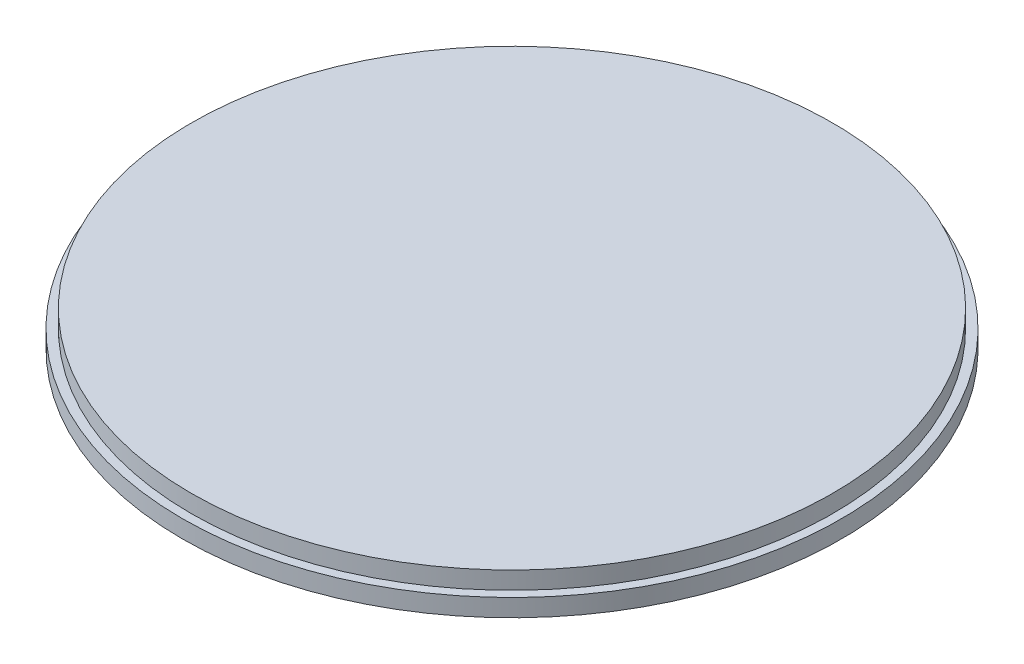
ISO-10303-21;
HEADER;
FILE_DESCRIPTION(('STEP AP214'),'2;1');
FILE_NAME('part.step','',(''),(''),'','','');
FILE_SCHEMA(('AUTOMOTIVE_DESIGN { 1 0 10303 214 1 1 1 1 }'));
ENDSEC;
DATA;
#1=APPLICATION_CONTEXT('core data for automotive mechanical design processes');
#2=APPLICATION_PROTOCOL_DEFINITION('international standard','automotive_design',2000,#1);
#3=PRODUCT_CONTEXT('',#1,'mechanical');
#4=PRODUCT('Part','Part','',(#3));
#5=PRODUCT_RELATED_PRODUCT_CATEGORY('part','',(#4));
#6=PRODUCT_DEFINITION_FORMATION('','',#4);
#7=PRODUCT_DEFINITION_CONTEXT('part definition',#1,'design');
#8=PRODUCT_DEFINITION('design','',#6,#7);
#9=PRODUCT_DEFINITION_SHAPE('','',#8);
#10=(LENGTH_UNIT() NAMED_UNIT(*) SI_UNIT(.MILLI.,.METRE.));
#11=(NAMED_UNIT(*) PLANE_ANGLE_UNIT() SI_UNIT($,.RADIAN.));
#12=(NAMED_UNIT(*) SI_UNIT($,.STERADIAN.) SOLID_ANGLE_UNIT());
#13=UNCERTAINTY_MEASURE_WITH_UNIT(LENGTH_MEASURE(1.E-05),#10,'distance_accuracy_value','');
#14=(GEOMETRIC_REPRESENTATION_CONTEXT(3) GLOBAL_UNCERTAINTY_ASSIGNED_CONTEXT((#13)) GLOBAL_UNIT_ASSIGNED_CONTEXT((#10,
#11,#12)) REPRESENTATION_CONTEXT('',''));
#15=CARTESIAN_POINT('',(0.,0.,0.));
#16=DIRECTION('',(0.,0.,1.));
#17=DIRECTION('',(1.,0.,0.));
#18=AXIS2_PLACEMENT_3D('',#15,#16,#17);
#19=CARTESIAN_POINT('',(0.,2.,0.));
#20=DIRECTION('',(0.,-1.,0.));
#21=DIRECTION('',(0.,0.,-1.));
#22=AXIS2_PLACEMENT_3D('',#19,#20,#21);
#23=CYLINDRICAL_SURFACE('',#22,18.75);
#24=CARTESIAN_POINT('',(0.,0.,0.));
#25=DIRECTION('',(0.,1.,0.));
#26=DIRECTION('',(0.,0.,1.));
#27=AXIS2_PLACEMENT_3D('',#24,#25,#26);
#28=CIRCLE('',#27,18.75);
#29=CARTESIAN_POINT('',(0.,0.,18.75));
#30=VERTEX_POINT('',#29);
#31=EDGE_CURVE('E11',#30,#30,#28,.T.);
#32=ORIENTED_EDGE('',*,*,#31,.T.);
#33=EDGE_LOOP('',(#32));
#34=FACE_BOUND('',#33,.T.);
#35=CARTESIAN_POINT('',(0.,1.,0.));
#36=DIRECTION('',(0.,1.,0.));
#37=DIRECTION('',(0.,0.,1.));
#38=AXIS2_PLACEMENT_3D('',#35,#36,#37);
#39=CIRCLE('',#38,18.75);
#40=CARTESIAN_POINT('',(0.,1.,18.75));
#41=VERTEX_POINT('',#40);
#42=EDGE_CURVE('E41',#41,#41,#39,.T.);
#43=ORIENTED_EDGE('',*,*,#42,.F.);
#44=EDGE_LOOP('',(#43));
#45=FACE_BOUND('',#44,.T.);
#46=ADVANCED_FACE('F38',(#34,#45),#23,.T.);
#47=CARTESIAN_POINT('',(0.,0.,0.));
#48=DIRECTION('',(0.,1.,0.));
#49=DIRECTION('',(0.,0.,1.));
#50=AXIS2_PLACEMENT_3D('',#47,#48,#49);
#51=PLANE('',#50);
#52=ORIENTED_EDGE('',*,*,#31,.F.);
#53=EDGE_LOOP('',(#52));
#54=FACE_BOUND('',#53,.T.);
#55=ADVANCED_FACE('F66',(#54),#51,.F.);
#56=CARTESIAN_POINT('',(0.,1.,0.));
#57=DIRECTION('',(0.,1.,0.));
#58=DIRECTION('',(0.,0.,1.));
#59=AXIS2_PLACEMENT_3D('',#56,#57,#58);
#60=PLANE('',#59);
#61=CARTESIAN_POINT('',(0.,1.,0.));
#62=DIRECTION('',(0.,1.,0.));
#63=DIRECTION('',(0.,0.,1.));
#64=AXIS2_PLACEMENT_3D('',#61,#62,#63);
#65=CIRCLE('',#64,18.25);
#66=CARTESIAN_POINT('',(0.,1.,18.25));
#67=VERTEX_POINT('',#66);
#68=EDGE_CURVE('E50',#67,#67,#65,.T.);
#69=ORIENTED_EDGE('',*,*,#68,.F.);
#70=EDGE_LOOP('',(#69));
#71=FACE_BOUND('',#70,.T.);
#72=ORIENTED_EDGE('',*,*,#42,.T.);
#73=EDGE_LOOP('',(#72));
#74=FACE_BOUND('',#73,.T.);
#75=ADVANCED_FACE('F63',(#71,#74),#60,.T.);
#76=CARTESIAN_POINT('',(0.,1.,0.));
#77=DIRECTION('',(0.,1.,0.));
#78=DIRECTION('',(0.,0.,1.));
#79=AXIS2_PLACEMENT_3D('',#76,#77,#78);
#80=CYLINDRICAL_SURFACE('',#79,18.25);
#81=ORIENTED_EDGE('',*,*,#68,.T.);
#82=EDGE_LOOP('',(#81));
#83=FACE_BOUND('',#82,.T.);
#84=CARTESIAN_POINT('',(0.,2.,0.));
#85=DIRECTION('',(0.,1.,0.));
#86=DIRECTION('',(0.,0.,1.));
#87=AXIS2_PLACEMENT_3D('',#84,#85,#86);
#88=CIRCLE('',#87,18.25);
#89=CARTESIAN_POINT('',(0.,2.,18.25));
#90=VERTEX_POINT('',#89);
#91=EDGE_CURVE('E52',#90,#90,#88,.T.);
#92=ORIENTED_EDGE('',*,*,#91,.F.);
#93=EDGE_LOOP('',(#92));
#94=FACE_BOUND('',#93,.T.);
#95=ADVANCED_FACE('F60',(#83,#94),#80,.T.);
#96=CARTESIAN_POINT('',(0.,2.,0.));
#97=DIRECTION('',(0.,1.,0.));
#98=DIRECTION('',(0.,0.,1.));
#99=AXIS2_PLACEMENT_3D('',#96,#97,#98);
#100=PLANE('',#99);
#101=ORIENTED_EDGE('',*,*,#91,.T.);
#102=EDGE_LOOP('',(#101));
#103=FACE_BOUND('',#102,.T.);
#104=ADVANCED_FACE('F78',(#103),#100,.T.);
#105=CLOSED_SHELL('',(#46,#55,#75,#95,#104));
#106=MANIFOLD_SOLID_BREP('B2',#105);
#107=ADVANCED_BREP_SHAPE_REPRESENTATION('',(#18,#106),#14);
#108=SHAPE_DEFINITION_REPRESENTATION(#9,#107);
ENDSEC;
END-ISO-10303-21;
